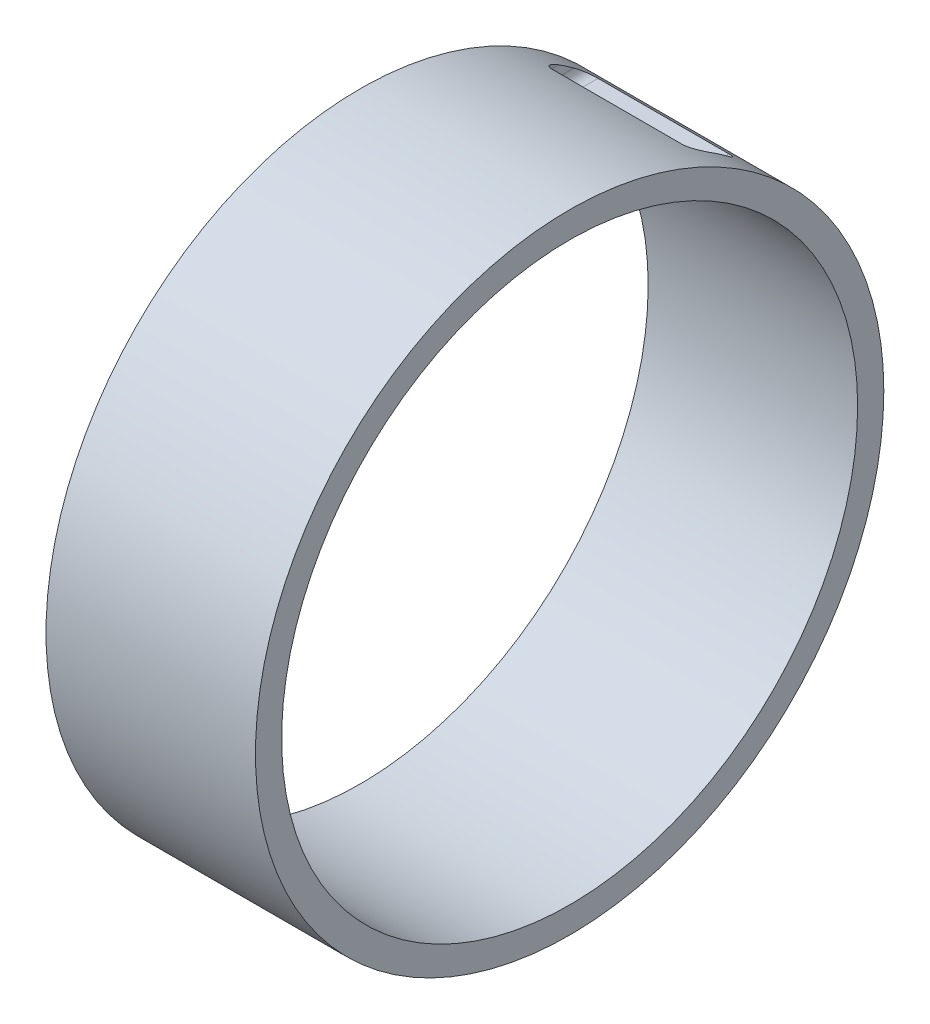
ISO-10303-21;
HEADER;
FILE_DESCRIPTION(('STEP AP214'),'2;1');
FILE_NAME('part.step','',(''),(''),'','','');
FILE_SCHEMA(('AUTOMOTIVE_DESIGN { 1 0 10303 214 1 1 1 1 }'));
ENDSEC;
DATA;
#1=APPLICATION_CONTEXT('core data for automotive mechanical design processes');
#2=APPLICATION_PROTOCOL_DEFINITION('international standard','automotive_design',2000,#1);
#3=PRODUCT_CONTEXT('',#1,'mechanical');
#4=PRODUCT('Part','Part','',(#3));
#5=PRODUCT_RELATED_PRODUCT_CATEGORY('part','',(#4));
#6=PRODUCT_DEFINITION_FORMATION('','',#4);
#7=PRODUCT_DEFINITION_CONTEXT('part definition',#1,'design');
#8=PRODUCT_DEFINITION('design','',#6,#7);
#9=PRODUCT_DEFINITION_SHAPE('','',#8);
#10=(LENGTH_UNIT() NAMED_UNIT(*) SI_UNIT(.MILLI.,.METRE.));
#11=(NAMED_UNIT(*) PLANE_ANGLE_UNIT() SI_UNIT($,.RADIAN.));
#12=(NAMED_UNIT(*) SI_UNIT($,.STERADIAN.) SOLID_ANGLE_UNIT());
#13=UNCERTAINTY_MEASURE_WITH_UNIT(LENGTH_MEASURE(1.E-05),#10,'distance_accuracy_value','');
#14=(GEOMETRIC_REPRESENTATION_CONTEXT(3) GLOBAL_UNCERTAINTY_ASSIGNED_CONTEXT((#13)) GLOBAL_UNIT_ASSIGNED_CONTEXT((#10,
#11,#12)) REPRESENTATION_CONTEXT('',''));
#15=CARTESIAN_POINT('',(0.,0.,0.));
#16=DIRECTION('',(0.,0.,1.));
#17=DIRECTION('',(1.,0.,0.));
#18=AXIS2_PLACEMENT_3D('',#15,#16,#17);
#19=CARTESIAN_POINT('',(25.4,0.,0.));
#20=DIRECTION('',(1.,0.,0.));
#21=DIRECTION('',(0.,0.,-1.));
#22=AXIS2_PLACEMENT_3D('',#19,#20,#21);
#23=PLANE('',#22);
#24=CARTESIAN_POINT('',(25.4,0.,0.));
#25=DIRECTION('',(1.,0.,0.));
#26=DIRECTION('',(0.,0.,-1.));
#27=AXIS2_PLACEMENT_3D('',#24,#25,#26);
#28=CIRCLE('',#27,76.2);
#29=CARTESIAN_POINT('',(25.4,0.,-76.2));
#30=VERTEX_POINT('',#29);
#31=EDGE_CURVE('E128',#30,#30,#28,.T.);
#32=ORIENTED_EDGE('',*,*,#31,.T.);
#33=EDGE_LOOP('',(#32));
#34=FACE_BOUND('',#33,.T.);
#35=CARTESIAN_POINT('',(25.4,0.,0.));
#36=DIRECTION('',(1.,0.,0.));
#37=DIRECTION('',(0.,0.,-1.));
#38=AXIS2_PLACEMENT_3D('',#35,#36,#37);
#39=CIRCLE('',#38,69.85);
#40=CARTESIAN_POINT('',(25.4,0.,-69.85));
#41=VERTEX_POINT('',#40);
#42=EDGE_CURVE('E220',#41,#41,#39,.T.);
#43=ORIENTED_EDGE('',*,*,#42,.F.);
#44=EDGE_LOOP('',(#43));
#45=FACE_BOUND('',#44,.T.);
#46=ADVANCED_FACE('F32',(#34,#45),#23,.T.);
#47=CARTESIAN_POINT('',(-25.4,0.,0.));
#48=DIRECTION('',(1.,0.,0.));
#49=DIRECTION('',(0.,0.,-1.));
#50=AXIS2_PLACEMENT_3D('',#47,#48,#49);
#51=PLANE('',#50);
#52=CARTESIAN_POINT('',(-25.4,0.,0.));
#53=DIRECTION('',(1.,0.,0.));
#54=DIRECTION('',(0.,0.,-1.));
#55=AXIS2_PLACEMENT_3D('',#52,#53,#54);
#56=CIRCLE('',#55,76.2);
#57=CARTESIAN_POINT('',(-25.4,0.,-76.2));
#58=VERTEX_POINT('',#57);
#59=EDGE_CURVE('E133',#58,#58,#56,.T.);
#60=ORIENTED_EDGE('',*,*,#59,.F.);
#61=EDGE_LOOP('',(#60));
#62=FACE_BOUND('',#61,.T.);
#63=CARTESIAN_POINT('',(-25.4,0.,0.));
#64=DIRECTION('',(1.,0.,0.));
#65=DIRECTION('',(0.,0.,-1.));
#66=AXIS2_PLACEMENT_3D('',#63,#64,#65);
#67=CIRCLE('',#66,69.85);
#68=CARTESIAN_POINT('',(-25.4,0.,-69.85));
#69=VERTEX_POINT('',#68);
#70=EDGE_CURVE('E221',#69,#69,#67,.T.);
#71=ORIENTED_EDGE('',*,*,#70,.T.);
#72=EDGE_LOOP('',(#71));
#73=FACE_BOUND('',#72,.T.);
#74=ADVANCED_FACE('F210',(#62,#73),#51,.F.);
#75=CARTESIAN_POINT('',(25.4,0.,0.));
#76=DIRECTION('',(-1.,0.,0.));
#77=DIRECTION('',(0.,0.,1.));
#78=AXIS2_PLACEMENT_3D('',#75,#76,#77);
#79=CYLINDRICAL_SURFACE('',#78,76.2);
#80=DIRECTION('',(-1.,0.,0.));
#81=VECTOR('',#80,1.);
#82=CARTESIAN_POINT('',(25.4,66.675,-36.8901663726257));
#83=LINE('',#82,#81);
#84=CARTESIAN_POINT('',(-15.875,66.675,-36.8901663726257));
#85=VERTEX_POINT('',#84);
#86=CARTESIAN_POINT('',(15.875,66.675,-36.8901663726257));
#87=VERTEX_POINT('',#86);
#88=EDGE_CURVE('E232',#85,#87,#83,.F.);
#89=ORIENTED_EDGE('',*,*,#88,.F.);
#90=CARTESIAN_POINT('',(-15.875,66.675,-36.8901663726257));
#91=CARTESIAN_POINT('',(-15.9125528643814,66.6750051266936,-36.8901567057449));
#92=CARTESIAN_POINT('',(-15.9500852718334,66.6741666158712,-36.8916726567766));
#93=CARTESIAN_POINT('',(-16.024800291679,66.6708532359372,-36.8976604526581));
#94=CARTESIAN_POINT('',(-16.0619832438782,66.6683801705647,-36.9021290392582));
#95=CARTESIAN_POINT('',(-16.1718129907983,66.6586583588189,-36.9196891904874));
#96=CARTESIAN_POINT('',(-16.2436241955906,66.6491043719812,-36.936940033587));
#97=CARTESIAN_POINT('',(-16.4002103086586,66.6216721216113,-36.9863997322653));
#98=CARTESIAN_POINT('',(-16.483878512848,66.6023324549095,-37.0212296641021));
#99=CARTESIAN_POINT('',(-16.6439449767763,66.55724858626,-37.1022212608402));
#100=CARTESIAN_POINT('',(-16.720307227958,66.5314747167076,-37.1484354040031));
#101=CARTESIAN_POINT('',(-16.9074586297388,66.458954348086,-37.2780841741451));
#102=CARTESIAN_POINT('',(-17.0126234805095,66.4086982144312,-37.3675893309396));
#103=CARTESIAN_POINT('',(-17.206655771776,66.3007905011026,-37.5587185006444));
#104=CARTESIAN_POINT('',(-17.2954893315623,66.2431239594759,-37.6603670014807));
#105=CARTESIAN_POINT('',(-17.4539542107774,66.1268504251507,-37.8641319733973));
#106=CARTESIAN_POINT('',(-17.5244775642815,66.0685704207115,-37.9657524768935));
#107=CARTESIAN_POINT('',(-17.6554110162912,65.9487305184317,-38.173542586677));
#108=CARTESIAN_POINT('',(-17.7158125052694,65.8871678865062,-38.2797159701593));
#109=CARTESIAN_POINT('',(-17.827937722729,65.7612724747456,-38.4955935422782));
#110=CARTESIAN_POINT('',(-17.8796264665118,65.6969297719986,-38.6053099518791));
#111=CARTESIAN_POINT('',(-17.9749789261709,65.5661647088155,-38.8269832295481));
#112=CARTESIAN_POINT('',(-18.0186402441688,65.4997417338916,-38.9389407560237));
#113=CARTESIAN_POINT('',(-18.1198592119057,65.3294020440842,-39.2243496693953));
#114=CARTESIAN_POINT('',(-18.1724736631223,65.2243164075517,-39.3988665500534));
#115=CARTESIAN_POINT('',(-18.2620006815305,65.0109062517826,-39.7500233913603));
#116=CARTESIAN_POINT('',(-18.2989027850477,64.9025796254251,-39.9266646865202));
#117=CARTESIAN_POINT('',(-18.3571617655918,64.6853486872083,-40.2776297786353));
#118=CARTESIAN_POINT('',(-18.3787896879128,64.5764908814272,-40.4519371432072));
#119=CARTESIAN_POINT('',(-18.4004735223983,64.4118369519973,-40.7132147608792));
#120=CARTESIAN_POINT('',(-18.4059084162904,64.3567589328186,-40.8002229603515));
#121=CARTESIAN_POINT('',(-18.4131694860146,64.2461813325217,-40.9741235983915));
#122=CARTESIAN_POINT('',(-18.4149956077825,64.1906817451005,-41.0610160352054));
#123=CARTESIAN_POINT('',(-18.415,64.135,-41.1478040118789));
#124=B_SPLINE_CURVE_WITH_KNOTS('',3,(#90,#91,#92,#93,#94,#95,#96,#97,#98,#99,#100,#101,#102,
#103,#104,#105,#106,#107,#108,#109,#110,#111,#112,#113,#114,#115,#116,#117,#118,#119,#120,#121,
#122,#123),.UNSPECIFIED.,.F.,.F.,(4,2,2,2,2,2,2,2,2,2,2,2,2,2,2,2,4),(0.,0.112580998817639,
0.225037970897442,0.447339872368279,0.723827977290132,1.00161528760194,1.44002369970265,
1.87933161070058,2.28894776232968,2.69891057888424,3.11048222919406,3.52217662133797,
4.15262471789859,4.78349200864135,5.40286216071111,5.71216479254917,6.02147205812361),.UNSPECIFIED.);
#125=CARTESIAN_POINT('',(-18.415,64.135,-41.1478040118789));
#126=VERTEX_POINT('',#125);
#127=EDGE_CURVE('E188',#85,#126,#124,.T.);
#128=ORIENTED_EDGE('',*,*,#127,.T.);
#129=CARTESIAN_POINT('',(-18.415,0.,0.));
#130=DIRECTION('',(-1.,0.,0.));
#131=DIRECTION('',(0.,0.,1.));
#132=AXIS2_PLACEMENT_3D('',#129,#130,#131);
#133=CIRCLE('',#132,76.2);
#134=CARTESIAN_POINT('',(-18.415,61.595,-44.8608512513973));
#135=VERTEX_POINT('',#134);
#136=EDGE_CURVE('E229',#135,#126,#133,.F.);
#137=ORIENTED_EDGE('',*,*,#136,.F.);
#138=CARTESIAN_POINT('',(-18.415,61.595,-44.8608512513973));
#139=CARTESIAN_POINT('',(-18.4149954250006,61.5386949247186,-44.9381597470649));
#140=CARTESIAN_POINT('',(-18.4131280407796,61.4822496064611,-45.0153542140712));
#141=CARTESIAN_POINT('',(-18.4055748552411,61.369148926074,-45.1694220987862));
#142=CARTESIAN_POINT('',(-18.3998883739413,61.312493528327,-45.2462954568691));
#143=CARTESIAN_POINT('',(-18.3769066681305,61.1419373863011,-45.4768081464263));
#144=CARTESIAN_POINT('',(-18.3536877724643,61.0278556746062,-45.6297785888821));
#145=CARTESIAN_POINT('',(-18.2899329455135,60.7987372144864,-45.9346319199144));
#146=CARTESIAN_POINT('',(-18.249171069149,60.6837079111032,-46.0864733666563));
#147=CARTESIAN_POINT('',(-18.1485926156648,60.4557573352468,-46.3850896151561));
#148=CARTESIAN_POINT('',(-18.0888114680992,60.3428325532014,-46.531873279642));
#149=CARTESIAN_POINT('',(-17.9865294744618,60.1820107642548,-46.7394081233));
#150=CARTESIAN_POINT('',(-17.9525689033565,60.1324602025622,-46.8031363108434));
#151=CARTESIAN_POINT('',(-17.8800077727999,60.0344672406605,-46.9287662029529));
#152=CARTESIAN_POINT('',(-17.8414072022475,59.9860248431028,-46.9906679031488));
#153=CARTESIAN_POINT('',(-17.7183937062005,59.8430589852029,-47.1727880971524));
#154=CARTESIAN_POINT('',(-17.6265736550603,59.7505801416987,-47.2898299587929));
#155=CARTESIAN_POINT('',(-17.4381115130021,59.5897730083474,-47.4922392813262));
#156=CARTESIAN_POINT('',(-17.3448864738581,59.5200005544768,-47.5796213264477));
#157=CARTESIAN_POINT('',(-17.1417989647074,59.3901684949479,-47.7415814398029));
#158=CARTESIAN_POINT('',(-17.0319600966361,59.3300953566409,-47.8161773565756));
#159=CARTESIAN_POINT('',(-16.8288682391994,59.2390691976159,-47.9288681477931));
#160=CARTESIAN_POINT('',(-16.7395991189078,59.204673949921,-47.9713330436526));
#161=CARTESIAN_POINT('',(-16.5535252545056,59.145370740913,-48.04443087896));
#162=CARTESIAN_POINT('',(-16.4567412649108,59.1204376960567,-48.0750951041207));
#163=CARTESIAN_POINT('',(-16.2793684029514,59.0861420139811,-48.1172359539401));
#164=CARTESIAN_POINT('',(-16.1998606045424,59.0745677776465,-48.1314408731894));
#165=CARTESIAN_POINT('',(-16.0790451985146,59.062882290818,-48.1457783216331));
#166=CARTESIAN_POINT('',(-16.0383936288196,59.0599328793916,-48.1493960829677));
#167=CARTESIAN_POINT('',(-15.9568328855824,59.0559894743263,-48.1542325430308));
#168=CARTESIAN_POINT('',(-15.9159235894076,59.054996495309,-48.1554499969407));
#169=CARTESIAN_POINT('',(-15.875,59.055,-48.1554459537029));
#170=B_SPLINE_CURVE_WITH_KNOTS('',3,(#138,#139,#140,#141,#142,#143,#144,#145,#146,#147,#148,
#149,#150,#151,#152,#153,#154,#155,#156,#157,#158,#159,#160,#161,#162,#163,#164,#165,#166,#167,
#168,#169),.UNSPECIFIED.,.F.,.F.,(4,2,2,2,2,2,2,2,2,2,2,2,2,2,2,4),(0.,0.286878193761009,
0.573807479136215,1.14974391110316,1.73333118240637,2.31583763674226,2.57843890786918,
2.84104080726816,3.36459765823201,3.79997090106545,4.23473135432006,4.54759887926013,
4.85963112562814,5.10349602452937,5.22614578998434,5.34885914586866),.UNSPECIFIED.);
#171=CARTESIAN_POINT('',(-15.875,59.055,-48.1554459537029));
#172=VERTEX_POINT('',#171);
#173=EDGE_CURVE('E112',#135,#172,#170,.T.);
#174=ORIENTED_EDGE('',*,*,#173,.T.);
#175=DIRECTION('',(-1.,0.,0.));
#176=VECTOR('',#175,1.);
#177=CARTESIAN_POINT('',(25.4,59.055,-48.1554459537029));
#178=LINE('',#177,#176);
#179=CARTESIAN_POINT('',(15.875,59.055,-48.1554459537029));
#180=VERTEX_POINT('',#179);
#181=EDGE_CURVE('E120',#180,#172,#178,.T.);
#182=ORIENTED_EDGE('',*,*,#181,.F.);
#183=CARTESIAN_POINT('',(15.875,59.055,-48.1554459537029));
#184=CARTESIAN_POINT('',(15.9283240424321,59.0549847477381,-48.1554637730757));
#185=CARTESIAN_POINT('',(15.9816347181549,59.0566786477897,-48.1533873426544));
#186=CARTESIAN_POINT('',(16.0876809929282,59.0633669615994,-48.1451839097741));
#187=CARTESIAN_POINT('',(16.1404171314554,59.068357947697,-48.1390611139263));
#188=CARTESIAN_POINT('',(16.2443356970763,59.0814546509494,-48.1229863557863));
#189=CARTESIAN_POINT('',(16.2955285773812,59.0895274452668,-48.1130748665393));
#190=CARTESIAN_POINT('',(16.3965242621352,59.1085854917785,-48.0896594923806));
#191=CARTESIAN_POINT('',(16.446326791244,59.1195713163997,-48.0761549014022));
#192=CARTESIAN_POINT('',(16.5927385837508,59.1564499766106,-48.0307811711515));
#193=CARTESIAN_POINT('',(16.6868669495011,59.1863324751737,-47.9939682892346));
#194=CARTESIAN_POINT('',(16.8669125376505,59.2546908080775,-47.909545742456));
#195=CARTESIAN_POINT('',(16.9528057674052,59.2931907234311,-47.861905816023));
#196=CARTESIAN_POINT('',(17.1558332986805,59.397337703253,-47.7326519743528));
#197=CARTESIAN_POINT('',(17.2675798023375,59.4670284147008,-47.6458467243563));
#198=CARTESIAN_POINT('',(17.4722395071392,59.6159798955069,-47.4593431025738));
#199=CARTESIAN_POINT('',(17.5651162635002,59.6952587210825,-47.3596203788733));
#200=CARTESIAN_POINT('',(17.7147635168004,59.8413780302971,-47.1747825507584));
#201=CARTESIAN_POINT('',(17.7749570911036,59.9070079695994,-47.0914235686855));
#202=CARTESIAN_POINT('',(17.8859522481032,60.0408957722613,-46.9205990025261));
#203=CARTESIAN_POINT('',(17.9367484806519,60.1091551060488,-46.8331311144471));
#204=CARTESIAN_POINT('',(18.0298268763155,60.2476678223506,-46.6548102189766));
#205=CARTESIAN_POINT('',(18.0720814025341,60.31792686423,-46.5639473158991));
#206=CARTESIAN_POINT('',(18.1485528399676,60.4596408632191,-46.3797944521438));
#207=CARTESIAN_POINT('',(18.182767929285,60.5310960874851,-46.2865039466328));
#208=CARTESIAN_POINT('',(18.2482654365433,60.6854644911023,-46.0839770164642));
#209=CARTESIAN_POINT('',(18.2783451379126,60.7684939189127,-45.9744413495075));
#210=CARTESIAN_POINT('',(18.3292942348228,60.9349867494797,-45.7535412578132));
#211=CARTESIAN_POINT('',(18.3501607212716,61.0184502809008,-45.6421762669586));
#212=CARTESIAN_POINT('',(18.3829942668417,61.1843479923943,-45.4195396050598));
#213=CARTESIAN_POINT('',(18.3950668943764,61.2667822956846,-45.3082834027356));
#214=CARTESIAN_POINT('',(18.4110550925861,61.431251737298,-45.0850373920885));
#215=CARTESIAN_POINT('',(18.4149776877874,61.5132871585158,-44.9730482990427));
#216=CARTESIAN_POINT('',(18.415,61.595,-44.8608512513973));
#217=B_SPLINE_CURVE_WITH_KNOTS('',3,(#183,#184,#185,#186,#187,#188,#189,#190,#191,#192,#193,
#194,#195,#196,#197,#198,#199,#200,#201,#202,#203,#204,#205,#206,#207,#208,#209,#210,#211,#212,
#213,#214,#215,#216),.UNSPECIFIED.,.F.,.F.,(4,2,2,2,2,2,2,2,2,2,2,2,2,2,2,2,4),(0.,
0.159883223173519,0.319600492290156,0.477657207520198,0.635745004840385,0.950364454739031,
1.26587432243975,1.73641791973754,2.20786185582576,2.57331859302011,2.93898275807396,
3.3058117412695,3.67272377525596,4.0944770709102,4.51636344098693,4.93309771020396,
5.34947264621507),.UNSPECIFIED.);
#218=CARTESIAN_POINT('',(18.415,61.595,-44.8608512513973));
#219=VERTEX_POINT('',#218);
#220=EDGE_CURVE('E11',#180,#219,#217,.T.);
#221=ORIENTED_EDGE('',*,*,#220,.T.);
#222=CARTESIAN_POINT('',(18.415,0.,0.));
#223=DIRECTION('',(1.,0.,0.));
#224=DIRECTION('',(0.,0.,-1.));
#225=AXIS2_PLACEMENT_3D('',#222,#223,#224);
#226=CIRCLE('',#225,76.2);
#227=CARTESIAN_POINT('',(18.415,64.135,-41.1478040118789));
#228=VERTEX_POINT('',#227);
#229=EDGE_CURVE('E225',#228,#219,#226,.F.);
#230=ORIENTED_EDGE('',*,*,#229,.F.);
#231=CARTESIAN_POINT('',(18.415,64.135,-41.1478040118789));
#232=CARTESIAN_POINT('',(18.414994791296,64.1930964531683,-41.0572523965933));
#233=CARTESIAN_POINT('',(18.4130073319023,64.2509940812318,-40.9665878397872));
#234=CARTESIAN_POINT('',(18.4051053570829,64.366329646873,-40.7851340810369));
#235=CARTESIAN_POINT('',(18.3991907421398,64.4237675727641,-40.6943448759921));
#236=CARTESIAN_POINT('',(18.3755880931376,64.5954717907566,-40.4216672271156));
#237=CARTESIAN_POINT('',(18.3520414851122,64.7089478006911,-40.2397504555502));
#238=CARTESIAN_POINT('',(18.2893035993684,64.9326000633337,-39.8778447918644));
#239=CARTESIAN_POINT('',(18.250188193226,65.042789573044,-39.6978508346417));
#240=CARTESIAN_POINT('',(18.1554941537809,65.259701968229,-39.3402456650143));
#241=CARTESIAN_POINT('',(18.0999306457791,65.3664279390781,-39.1626324195301));
#242=CARTESIAN_POINT('',(18.0094159473272,65.5127795872172,-38.9168654461332));
#243=CARTESIAN_POINT('',(17.9820929367444,65.5542537427461,-38.8469603641203));
#244=CARTESIAN_POINT('',(17.924360138557,65.6364136182305,-38.707980145052));
#245=CARTESIAN_POINT('',(17.893950618764,65.6770994062273,-38.6389049365704));
#246=CARTESIAN_POINT('',(17.7975396608975,65.7981735994089,-38.4326133907557));
#247=CARTESIAN_POINT('',(17.7265514849623,65.8772562144536,-38.2968732180157));
#248=CARTESIAN_POINT('',(17.5985992437237,66.0019549776911,-38.0813755757444));
#249=CARTESIAN_POINT('',(17.5463187629795,66.0490264426534,-37.9996662716716));
#250=CARTESIAN_POINT('',(17.43489309589,66.1408804359337,-37.8395618323535));
#251=CARTESIAN_POINT('',(17.3757435884195,66.1856614976287,-37.7611688260656));
#252=CARTESIAN_POINT('',(17.2500342520179,66.2719753028588,-37.6094783350357));
#253=CARTESIAN_POINT('',(17.1835183605778,66.3135250312667,-37.5361544688496));
#254=CARTESIAN_POINT('',(17.0418101161598,66.3925936501046,-37.3961220522209));
#255=CARTESIAN_POINT('',(16.9666330673319,66.4301194308937,-37.3294022090378));
#256=CARTESIAN_POINT('',(16.8209875759392,66.4933478538367,-37.2166372916694));
#257=CARTESIAN_POINT('',(16.7521376622924,66.5199604789654,-37.1690371224276));
#258=CARTESIAN_POINT('',(16.607493184095,66.5682849022914,-37.082420380964));
#259=CARTESIAN_POINT('',(16.5316956315045,66.5899945777928,-37.0434075267413));
#260=CARTESIAN_POINT('',(16.3723445600028,66.6271855500242,-36.9764743957922));
#261=CARTESIAN_POINT('',(16.2886962878064,66.6425741454509,-36.9487192877285));
#262=CARTESIAN_POINT('',(16.1599512564808,66.6593385607275,-36.9184602696288));
#263=CARTESIAN_POINT('',(16.1165476071526,66.6638718664291,-36.9102727276992));
#264=CARTESIAN_POINT('',(16.0290077275359,66.6707047193147,-36.8979293009515));
#265=CARTESIAN_POINT('',(15.9848720964481,66.6730060099132,-36.8937702694896));
#266=CARTESIAN_POINT('',(15.9187656988574,66.6747182922638,-36.8906754794021));
#267=CARTESIAN_POINT('',(15.896880380674,66.6750025759466,-36.8901615812883));
#268=CARTESIAN_POINT('',(15.875,66.675,-36.8901663726256));
#269=B_SPLINE_CURVE_WITH_KNOTS('',3,(#231,#232,#233,#234,#235,#236,#237,#238,#239,#240,#241,
#242,#243,#244,#245,#246,#247,#248,#249,#250,#251,#252,#253,#254,#255,#256,#257,#258,#259,#260,
#261,#262,#263,#264,#265,#266,#267,#268),.UNSPECIFIED.,.F.,.F.,(4,2,2,2,2,2,2,2,2,2,2,2,2,2,2,2,
2,2,4),(0.,0.322716460208758,0.645441098625899,1.29189205574998,1.93523049075487,
2.57797915445026,2.83518039440891,3.09235933646852,3.60869358306117,3.93193124518363,
4.25537336054707,4.57698078358536,4.89802840306839,5.16085367774551,5.42379252347253,
5.69046052110118,5.82345943895553,5.95635438823333,6.02200118957834),.UNSPECIFIED.);
#270=EDGE_CURVE('E187',#228,#87,#269,.T.);
#271=ORIENTED_EDGE('',*,*,#270,.T.);
#272=EDGE_LOOP('',(#89,#128,#137,#174,#182,#221,#230,#271));
#273=FACE_BOUND('',#272,.T.);
#274=ORIENTED_EDGE('',*,*,#31,.F.);
#275=EDGE_LOOP('',(#274));
#276=FACE_BOUND('',#275,.T.);
#277=ORIENTED_EDGE('',*,*,#59,.T.);
#278=EDGE_LOOP('',(#277));
#279=FACE_BOUND('',#278,.T.);
#280=ADVANCED_FACE('F170',(#273,#276,#279),#79,.T.);
#281=CARTESIAN_POINT('',(25.4,0.,0.));
#282=DIRECTION('',(-1.,0.,0.));
#283=DIRECTION('',(0.,0.,1.));
#284=AXIS2_PLACEMENT_3D('',#281,#282,#283);
#285=CYLINDRICAL_SURFACE('',#284,69.85);
#286=CARTESIAN_POINT('',(-18.415,0.,0.));
#287=DIRECTION('',(-1.,0.,0.));
#288=DIRECTION('',(0.,0.,1.));
#289=AXIS2_PLACEMENT_3D('',#286,#287,#288);
#290=CIRCLE('',#289,69.85);
#291=CARTESIAN_POINT('',(-18.415,64.135,-27.6717233832661));
#292=VERTEX_POINT('',#291);
#293=CARTESIAN_POINT('',(-18.415,61.595,-32.940529367331));
#294=VERTEX_POINT('',#293);
#295=EDGE_CURVE('E139',#292,#294,#290,.T.);
#296=ORIENTED_EDGE('',*,*,#295,.F.);
#297=CARTESIAN_POINT('',(-18.415,64.135,-27.6717233832661));
#298=CARTESIAN_POINT('',(-18.4149655871479,64.2200060511905,-27.4747089466487));
#299=CARTESIAN_POINT('',(-18.4107323758047,64.3040955872121,-27.2773134861748));
#300=CARTESIAN_POINT('',(-18.3941611692197,64.4703360278681,-26.882041774125));
#301=CARTESIAN_POINT('',(-18.381823059328,64.5524869050615,-26.6841655157873));
#302=CARTESIAN_POINT('',(-18.3492577462212,64.7151272751901,-26.2872789176954));
#303=CARTESIAN_POINT('',(-18.3289933574519,64.7956070259303,-26.0882676547492));
#304=CARTESIAN_POINT('',(-18.2806321770556,64.9544063753349,-25.6903381817574));
#305=CARTESIAN_POINT('',(-18.2525355465209,65.0327260183918,-25.4914199698821));
#306=CARTESIAN_POINT('',(-18.1883310469536,65.1871895220412,-25.0937912750126));
#307=CARTESIAN_POINT('',(-18.1522150825501,65.2633310956089,-24.8950812072486));
#308=CARTESIAN_POINT('',(-18.0715763496081,65.4132412024969,-24.4984755832883));
#309=CARTESIAN_POINT('',(-18.0270540735811,65.4870098745452,-24.3005799800676));
#310=CARTESIAN_POINT('',(-17.9289146113785,65.6318894636787,-23.9065173861973));
#311=CARTESIAN_POINT('',(-17.8753149158564,65.7030051769194,-23.7103478203642));
#312=CARTESIAN_POINT('',(-17.7576671994677,65.8424871326704,-23.3202108949776));
#313=CARTESIAN_POINT('',(-17.6936236179624,65.910854528078,-23.126242637026));
#314=CARTESIAN_POINT('',(-17.5976526451064,66.0018951368887,-22.8643348226802));
#315=CARTESIAN_POINT('',(-17.5712562217267,66.0259324328842,-22.7948263827843));
#316=CARTESIAN_POINT('',(-17.5166089871914,66.0735656885774,-22.6563847788794));
#317=CARTESIAN_POINT('',(-17.4883581519876,66.0971616425466,-22.5874516223438));
#318=CARTESIAN_POINT('',(-17.4297332636695,66.1439335199561,-22.4501188078989));
#319=CARTESIAN_POINT('',(-17.3993539739532,66.1671082172208,-22.3817209613764));
#320=CARTESIAN_POINT('',(-17.3362847869096,66.2129235578465,-22.245817478841));
#321=CARTESIAN_POINT('',(-17.3035949849055,66.2355642231883,-22.1783118061564));
#322=CARTESIAN_POINT('',(-17.2323290289384,66.2823815025991,-22.0380212146081));
#323=CARTESIAN_POINT('',(-17.1934889413216,66.3064977450748,-21.9653493426163));
#324=CARTESIAN_POINT('',(-17.1121058556332,66.3538707177611,-21.8218250273853));
#325=CARTESIAN_POINT('',(-17.0695635952074,66.3771276178833,-21.7509722253292));
#326=CARTESIAN_POINT('',(-16.9801841244933,66.4225037623043,-21.6120062859227));
#327=CARTESIAN_POINT('',(-16.9333626100423,66.4446267336899,-21.5438843582285));
#328=CARTESIAN_POINT('',(-16.8343371598464,66.4874851941528,-21.4112505901759));
#329=CARTESIAN_POINT('',(-16.782138912998,66.5082221122049,-21.3467350433556));
#330=CARTESIAN_POINT('',(-16.6826461892228,66.5436255492691,-21.236078586104));
#331=CARTESIAN_POINT('',(-16.6366217767202,66.5586526773559,-21.1889230689157));
#332=CARTESIAN_POINT('',(-16.539389066969,66.5870927104255,-21.0993789201579));
#333=CARTESIAN_POINT('',(-16.4881690939076,66.6005018244385,-21.0570014982163));
#334=CARTESIAN_POINT('',(-16.3788978110344,66.6251578414968,-20.9788594645393));
#335=CARTESIAN_POINT('',(-16.3207438440661,66.6363634264211,-20.9432216257939));
#336=CARTESIAN_POINT('',(-16.1983842716333,66.6550749001558,-20.8835935598267));
#337=CARTESIAN_POINT('',(-16.1342274133746,66.6626079516372,-20.8595178377126));
#338=CARTESIAN_POINT('',(-16.0365966445387,66.670050990462,-20.8357113316305));
#339=CARTESIAN_POINT('',(-16.0047326866866,66.6718865071072,-20.8298362452215));
#340=CARTESIAN_POINT('',(-15.9402636349557,66.6743696551884,-20.8218860192315));
#341=CARTESIAN_POINT('',(-15.9076548901879,66.6750087807403,-20.8198380894444));
#342=CARTESIAN_POINT('',(-15.875,66.675,-20.8198673146589));
#343=B_SPLINE_CURVE_WITH_KNOTS('',3,(#297,#298,#299,#300,#301,#302,#303,#304,#305,#306,#307,
#308,#309,#310,#311,#312,#313,#314,#315,#316,#317,#318,#319,#320,#321,#322,#323,#324,#325,#326,
#327,#328,#329,#330,#331,#332,#333,#334,#335,#336,#337,#338,#339,#340,#341,#342),.UNSPECIFIED.,
.F.,.F.,(4,2,2,2,2,2,2,2,2,2,2,2,2,2,2,2,2,2,2,2,2,2,4),(0.,0.643651006086674,1.28731111730163,
1.93402784711191,2.58073127633627,3.22809053306778,3.87541187387717,4.52149983854988,
5.16731388436583,5.4017172196681,5.63612359532442,5.87112842943751,6.10612357376033,
6.36360839006271,6.62104202031251,6.87756665498658,7.13382260654819,7.33629623690707,
7.53923540785781,7.7456775936118,7.95056881692398,8.04769549367407,8.14551011927511),.UNSPECIFIED.);
#344=CARTESIAN_POINT('',(-15.875,66.675,-20.8198673146589));
#345=VERTEX_POINT('',#344);
#346=EDGE_CURVE('E176',#292,#345,#343,.T.);
#347=ORIENTED_EDGE('',*,*,#346,.T.);
#348=DIRECTION('',(-1.,0.,0.));
#349=VECTOR('',#348,1.);
#350=CARTESIAN_POINT('',(25.4,66.675,-20.8198673146589));
#351=LINE('',#350,#349);
#352=CARTESIAN_POINT('',(15.875,66.675,-20.8198673146589));
#353=VERTEX_POINT('',#352);
#354=EDGE_CURVE('E130',#353,#345,#351,.T.);
#355=ORIENTED_EDGE('',*,*,#354,.F.);
#356=CARTESIAN_POINT('',(15.875,66.675,-20.8198673146589));
#357=CARTESIAN_POINT('',(15.9003396125104,66.6750033144349,-20.8198563055346));
#358=CARTESIAN_POINT('',(15.9256615483526,66.6746205222922,-20.8210826059251));
#359=CARTESIAN_POINT('',(15.9760150119385,66.6731146258585,-20.825904450396));
#360=CARTESIAN_POINT('',(16.0010469560946,66.6719927663555,-20.82949601074));
#361=CARTESIAN_POINT('',(16.0746881405233,66.6676098842046,-20.8435215205754));
#362=CARTESIAN_POINT('',(16.122637174185,66.6633293984337,-20.8572133977717));
#363=CARTESIAN_POINT('',(16.2275586129546,66.6511049928709,-20.8962487351197));
#364=CARTESIAN_POINT('',(16.2836450471298,66.6424987849916,-20.9236933755151));
#365=CARTESIAN_POINT('',(16.3908242071986,66.6226745702285,-20.9867297981499));
#366=CARTESIAN_POINT('',(16.4418829809888,66.6114403339929,-21.0223721814652));
#367=CARTESIAN_POINT('',(16.5341062085355,66.5884052604463,-21.0952149942723));
#368=CARTESIAN_POINT('',(16.5757483260099,66.5767808660038,-21.1318802165264));
#369=CARTESIAN_POINT('',(16.6556268083153,66.552429740704,-21.2084466982128));
#370=CARTESIAN_POINT('',(16.6938601636623,66.5397020549587,-21.2483507588884));
#371=CARTESIAN_POINT('',(16.7674145925732,66.513386770313,-21.3305824600472));
#372=CARTESIAN_POINT('',(16.80273110168,66.4997978803465,-21.3729137297542));
#373=CARTESIAN_POINT('',(16.8707852237047,66.471955510954,-21.4593498112414));
#374=CARTESIAN_POINT('',(16.9035237481536,66.4577022692948,-21.5034539877448));
#375=CARTESIAN_POINT('',(16.9833736421505,66.4210293995348,-21.6165329422631));
#376=CARTESIAN_POINT('',(17.0290203883911,66.3982464863508,-21.6864227042626));
#377=CARTESIAN_POINT('',(17.11610465125,66.3516838752997,-21.8284711713065));
#378=CARTESIAN_POINT('',(17.1575400122587,66.3279036756777,-21.9006310137997));
#379=CARTESIAN_POINT('',(17.2767028441228,66.2552693403793,-22.1197973470519));
#380=CARTESIAN_POINT('',(17.3491415692876,66.2051917443935,-22.2692735347487));
#381=CARTESIAN_POINT('',(17.484076641036,66.1021545666701,-22.5732968142502));
#382=CARTESIAN_POINT('',(17.5464787618297,66.0491733017728,-22.7278771972533));
#383=CARTESIAN_POINT('',(17.6626303631928,65.9411713163792,-23.0393482769491));
#384=CARTESIAN_POINT('',(17.7163879578241,65.8861525687381,-23.1962366544723));
#385=CARTESIAN_POINT('',(17.8241110891971,65.7659534466322,-23.5350547927376));
#386=CARTESIAN_POINT('',(17.8769223296648,65.7004772400465,-23.717243867812));
#387=CARTESIAN_POINT('',(17.9742797113209,65.5672788924917,-24.083030189328));
#388=CARTESIAN_POINT('',(18.0188241302589,65.4995562869803,-24.2666277209195));
#389=CARTESIAN_POINT('',(18.100459558086,65.3619220663292,-24.6349416124252));
#390=CARTESIAN_POINT('',(18.1375404973617,65.2920076389731,-24.8196591420721));
#391=CARTESIAN_POINT('',(18.2046291702263,65.1501750756165,-25.1896096853565));
#392=CARTESIAN_POINT('',(18.234636725123,65.078256889047,-25.3748427118974));
#393=CARTESIAN_POINT('',(18.2865113179571,64.9360368464523,-25.7365407331102));
#394=CARTESIAN_POINT('',(18.3087026699893,64.8658258543645,-25.9129951146013));
#395=CARTESIAN_POINT('',(18.3469235985031,64.7237312360947,-26.2658961451669));
#396=CARTESIAN_POINT('',(18.3629532271501,64.6518476240785,-26.4423427942942));
#397=CARTESIAN_POINT('',(18.3887380674612,64.5066816077371,-26.7945272024096));
#398=CARTESIAN_POINT('',(18.3985111421064,64.4334038063639,-26.9702655431557));
#399=CARTESIAN_POINT('',(18.4116314086108,64.2853248045174,-27.3213443500954));
#400=CARTESIAN_POINT('',(18.414978418555,64.2105235609777,-27.4966848048849));
#401=CARTESIAN_POINT('',(18.415,64.135,-27.6717233832661));
#402=B_SPLINE_CURVE_WITH_KNOTS('',3,(#356,#357,#358,#359,#360,#361,#362,#363,#364,#365,#366,
#367,#368,#369,#370,#371,#372,#373,#374,#375,#376,#377,#378,#379,#380,#381,#382,#383,#384,#385,
#386,#387,#388,#389,#390,#391,#392,#393,#394,#395,#396,#397,#398,#399,#400,#401),.UNSPECIFIED.,
.F.,.F.,(4,2,2,2,2,2,2,2,2,2,2,2,2,2,2,2,2,2,2,2,2,2,4),(0.,0.0759546148166747,
0.151781627614934,0.301092882854172,0.489137565247463,0.678375689064753,0.848194720546339,
1.01816222496552,1.18839085492709,1.3585590221597,1.61795315462278,1.87747939705793,
2.39734030670184,2.92182801311892,3.44582050615279,4.04761590010947,4.64953652740898,
5.25226389209122,5.85500648161529,6.42850633969172,7.00200134240504,7.57385157967336,
8.14571800517554),.UNSPECIFIED.);
#403=CARTESIAN_POINT('',(18.415,64.135,-27.6717233832661));
#404=VERTEX_POINT('',#403);
#405=EDGE_CURVE('E182',#353,#404,#402,.T.);
#406=ORIENTED_EDGE('',*,*,#405,.T.);
#407=CARTESIAN_POINT('',(18.415,0.,0.));
#408=DIRECTION('',(1.,0.,0.));
#409=DIRECTION('',(0.,0.,-1.));
#410=AXIS2_PLACEMENT_3D('',#407,#408,#409);
#411=CIRCLE('',#410,69.85);
#412=CARTESIAN_POINT('',(18.415,61.595,-32.940529367331));
#413=VERTEX_POINT('',#412);
#414=EDGE_CURVE('E127',#413,#404,#411,.T.);
#415=ORIENTED_EDGE('',*,*,#414,.F.);
#416=CARTESIAN_POINT('',(18.415,61.595,-32.940529367331));
#417=CARTESIAN_POINT('',(18.4149965756116,61.5447208326439,-33.0345458771741));
#418=CARTESIAN_POINT('',(18.4135074460487,61.4942286724588,-33.1284424109865));
#419=CARTESIAN_POINT('',(18.4074529480481,61.39285107015,-33.3159375796031));
#420=CARTESIAN_POINT('',(18.4028872075502,61.3419655811961,-33.4095361770018));
#421=CARTESIAN_POINT('',(18.3843902417523,61.1885537218586,-33.6901899182754));
#422=CARTESIAN_POINT('',(18.3656583001589,61.0855015761229,-33.8766736715788));
#423=CARTESIAN_POINT('',(18.3140728225795,60.8780599501757,-34.2480623710268));
#424=CARTESIAN_POINT('',(18.2811555978145,60.7736665236058,-34.4329563143731));
#425=CARTESIAN_POINT('',(18.199412056158,60.5648125744928,-34.7989979436126));
#426=CARTESIAN_POINT('',(18.1506039062315,60.4603522638765,-34.9801496574177));
#427=CARTESIAN_POINT('',(18.0690643919384,60.3143791549227,-35.2307418543399));
#428=CARTESIAN_POINT('',(18.0440646458886,60.2724204491598,-35.3024737661106));
#429=CARTESIAN_POINT('',(17.9908008760727,60.1887835784358,-35.4448818326839));
#430=CARTESIAN_POINT('',(17.9625368806702,60.1471054110404,-35.5155579966541));
#431=CARTESIAN_POINT('',(17.8724714825177,60.0226704227117,-35.7257331460062));
#432=CARTESIAN_POINT('',(17.8053955399615,59.9405110415728,-35.8633823469918));
#433=CARTESIAN_POINT('',(17.6540446210266,59.7786886625215,-36.1324732435391));
#434=CARTESIAN_POINT('',(17.5696449217761,59.6990488946273,-36.2638608937051));
#435=CARTESIAN_POINT('',(17.4279487909905,59.5841247667475,-36.4521607627257));
#436=CARTESIAN_POINT('',(17.3782382763593,59.5465958275471,-36.5134263905863));
#437=CARTESIAN_POINT('',(17.2732736026396,59.4735565958684,-36.6322728481603));
#438=CARTESIAN_POINT('',(17.2180225440177,59.4380451916238,-36.6898557095119));
#439=CARTESIAN_POINT('',(17.0923545552796,59.364360843881,-36.8089770741373));
#440=CARTESIAN_POINT('',(17.0209162139796,59.3266363973996,-36.8697321671675));
#441=CARTESIAN_POINT('',(16.8692493551187,59.2561853631774,-36.9828533210986));
#442=CARTESIAN_POINT('',(16.7890167297289,59.2234611282781,-37.0352154332602));
#443=CARTESIAN_POINT('',(16.6185946857404,59.1645886700025,-37.1291942630116));
#444=CARTESIAN_POINT('',(16.5282883613324,59.138532435922,-37.1706608588306));
#445=CARTESIAN_POINT('',(16.3400507088259,59.0960948789629,-37.2380946970258));
#446=CARTESIAN_POINT('',(16.2421509575031,59.0796756910802,-37.2641226040265));
#447=CARTESIAN_POINT('',(16.0982600735666,59.0644412648129,-37.2882601526032));
#448=CARTESIAN_POINT('',(16.0539208607108,59.0609171374504,-37.2938412545461));
#449=CARTESIAN_POINT('',(15.9647332905033,59.0561916787439,-37.3013235039372));
#450=CARTESIAN_POINT('',(15.919884177351,59.0549944269551,-37.3032181882421));
#451=CARTESIAN_POINT('',(15.875,59.055,-37.3032099825203));
#452=B_SPLINE_CURVE_WITH_KNOTS('',3,(#416,#417,#418,#419,#420,#421,#422,#423,#424,#425,#426,
#427,#428,#429,#430,#431,#432,#433,#434,#435,#436,#437,#438,#439,#440,#441,#442,#443,#444,#445,
#446,#447,#448,#449,#450,#451),.UNSPECIFIED.,.F.,.F.,(4,2,2,2,2,2,2,2,2,2,2,2,2,2,2,2,2,4),(0.,
0.319826804388957,0.639692292955927,1.28088164044276,1.9249802795679,2.56834513701916,
2.82863233903599,3.08891727954294,3.6094743908529,4.13391970983611,4.39579830424209,
4.65753116164991,4.96007853383574,5.26276783367819,5.56943163568177,5.87488231344983,
6.00917812381471,6.14370917439673),.UNSPECIFIED.);
#453=CARTESIAN_POINT('',(15.875,59.055,-37.3032099825203));
#454=VERTEX_POINT('',#453);
#455=EDGE_CURVE('E45',#413,#454,#452,.T.);
#456=ORIENTED_EDGE('',*,*,#455,.T.);
#457=DIRECTION('',(-1.,0.,0.));
#458=VECTOR('',#457,1.);
#459=CARTESIAN_POINT('',(25.4,59.055,-37.3032099825203));
#460=LINE('',#459,#458);
#461=CARTESIAN_POINT('',(-15.875,59.055,-37.3032099825203));
#462=VERTEX_POINT('',#461);
#463=EDGE_CURVE('E118',#462,#454,#460,.F.);
#464=ORIENTED_EDGE('',*,*,#463,.F.);
#465=CARTESIAN_POINT('',(-15.875,59.055,-37.3032099825203));
#466=CARTESIAN_POINT('',(-15.9156332119058,59.0549950417475,-37.3032173848645));
#467=CARTESIAN_POINT('',(-15.9562437879739,59.055975871629,-37.3016651092769));
#468=CARTESIAN_POINT('',(-16.0371096457003,59.0598563035641,-37.2955210948858));
#469=CARTESIAN_POINT('',(-16.0773651903074,59.0627543387854,-37.2909318380485));
#470=CARTESIAN_POINT('',(-16.196491399841,59.0741763678042,-37.2728372515356));
#471=CARTESIAN_POINT('',(-16.2744870923759,59.0854304466085,-37.2550018119008));
#472=CARTESIAN_POINT('',(-16.4258498819217,59.1142529755776,-37.2092502759819));
#473=CARTESIAN_POINT('',(-16.4992300329219,59.131802580367,-37.1813642644745));
#474=CARTESIAN_POINT('',(-16.6408497312918,59.1720866666944,-37.1172211127363));
#475=CARTESIAN_POINT('',(-16.7090769013773,59.194833134934,-37.0809446172057));
#476=CARTESIAN_POINT('',(-16.8847735465355,59.2613600188598,-36.9745836870231));
#477=CARTESIAN_POINT('',(-16.9871047054262,59.3088744680651,-36.8983642355838));
#478=CARTESIAN_POINT('',(-17.1767640020103,59.4112666810955,-36.7332735690298));
#479=CARTESIAN_POINT('',(-17.2640494271107,59.4661646449657,-36.6443676035712));
#480=CARTESIAN_POINT('',(-17.4135890635028,59.5722637889583,-36.4715868643231));
#481=CARTESIAN_POINT('',(-17.4776375738936,59.6228446756277,-36.3888553762178));
#482=CARTESIAN_POINT('',(-17.5971909990075,59.7263331504095,-36.2187458254684));
#483=CARTESIAN_POINT('',(-17.6526895823248,59.7792424258236,-36.1313643832429));
#484=CARTESIAN_POINT('',(-17.7561764631109,59.8866833310877,-35.953004329982));
#485=CARTESIAN_POINT('',(-17.804151781956,59.9412175755375,-35.8620198345447));
#486=CARTESIAN_POINT('',(-17.8933227637969,60.0513076853539,-35.6773670899374));
#487=CARTESIAN_POINT('',(-17.9345159304306,60.1068639185645,-35.583697867406));
#488=CARTESIAN_POINT('',(-18.0438664540415,60.2669943039274,-35.3122345846256));
#489=CARTESIAN_POINT('',(-18.1044774995722,60.3723487359733,-35.1318436688407));
#490=CARTESIAN_POINT('',(-18.2079154361107,60.5836032170341,-34.7662799638023));
#491=CARTESIAN_POINT('',(-18.2507258759628,60.6895036795997,-34.5811029183523));
#492=CARTESIAN_POINT('',(-18.3208235344012,60.9007896954619,-34.2076356728384));
#493=CARTESIAN_POINT('',(-18.3481134393099,61.0061753347327,-34.0193460173199));
#494=CARTESIAN_POINT('',(-18.3887922714948,61.2157485111421,-33.6407702360785));
#495=CARTESIAN_POINT('',(-18.4021892254632,61.319936705657,-33.4504853273867));
#496=CARTESIAN_POINT('',(-18.4111391775841,61.452078155039,-33.2064488888967));
#497=CARTESIAN_POINT('',(-18.4125923289884,61.4807829437957,-33.1532726028248));
#498=CARTESIAN_POINT('',(-18.4145219660113,61.538014149197,-33.0469204619488));
#499=CARTESIAN_POINT('',(-18.4150000721507,61.5665407831187,-32.9937447535527));
#500=CARTESIAN_POINT('',(-18.415,61.595,-32.940529367331));
#501=B_SPLINE_CURVE_WITH_KNOTS('',3,(#465,#466,#467,#468,#469,#470,#471,#472,#473,#474,#475,
#476,#477,#478,#479,#480,#481,#482,#483,#484,#485,#486,#487,#488,#489,#490,#491,#492,#493,#494,
#495,#496,#497,#498,#499,#500),.UNSPECIFIED.,.F.,.F.,(4,2,2,2,2,2,2,2,2,2,2,2,2,2,2,2,2,4),(0.,
0.121815747677844,0.243532064449151,0.484700431984394,0.725152815894187,0.966165511052878,
1.37229590431709,1.77956090360794,2.12770265069783,2.47610097771937,2.82509387821398,
3.17421494957172,3.82570820125818,4.47780222586042,5.12978335047004,5.78138758090059,
5.96272281480566,6.14375642392194),.UNSPECIFIED.);
#502=EDGE_CURVE('E102',#462,#294,#501,.T.);
#503=ORIENTED_EDGE('',*,*,#502,.T.);
#504=EDGE_LOOP('',(#296,#347,#355,#406,#415,#456,#464,#503));
#505=FACE_BOUND('',#504,.T.);
#506=ORIENTED_EDGE('',*,*,#42,.T.);
#507=EDGE_LOOP('',(#506));
#508=FACE_BOUND('',#507,.T.);
#509=ORIENTED_EDGE('',*,*,#70,.F.);
#510=EDGE_LOOP('',(#509));
#511=FACE_BOUND('',#510,.T.);
#512=ADVANCED_FACE('F124',(#505,#508,#511),#285,.F.);
#513=CARTESIAN_POINT('',(-18.415,66.675,-76.201));
#514=DIRECTION('',(-1.,0.,0.));
#515=DIRECTION('',(0.,0.,1.));
#516=AXIS2_PLACEMENT_3D('',#513,#514,#515);
#517=PLANE('',#516);
#518=ORIENTED_EDGE('',*,*,#295,.T.);
#519=DIRECTION('',(0.,0.,1.));
#520=VECTOR('',#519,1.);
#521=CARTESIAN_POINT('',(-18.415,61.595,-48.1554459537029));
#522=LINE('',#521,#520);
#523=EDGE_CURVE('E107',#294,#135,#522,.F.);
#524=ORIENTED_EDGE('',*,*,#523,.T.);
#525=ORIENTED_EDGE('',*,*,#136,.T.);
#526=DIRECTION('',(0.,0.,1.));
#527=VECTOR('',#526,1.);
#528=CARTESIAN_POINT('',(-18.415,64.135,-20.8198673146589));
#529=LINE('',#528,#527);
#530=EDGE_CURVE('E121',#126,#292,#529,.T.);
#531=ORIENTED_EDGE('',*,*,#530,.T.);
#532=EDGE_LOOP('',(#518,#524,#525,#531));
#533=FACE_BOUND('',#532,.T.);
#534=ADVANCED_FACE('F169',(#533),#517,.F.);
#535=CARTESIAN_POINT('',(-18.415,66.675,-76.201));
#536=DIRECTION('',(0.,1.,0.));
#537=DIRECTION('',(0.,0.,1.));
#538=AXIS2_PLACEMENT_3D('',#535,#536,#537);
#539=PLANE('',#538);
#540=ORIENTED_EDGE('',*,*,#354,.T.);
#541=DIRECTION('',(0.,0.,1.));
#542=VECTOR('',#541,1.);
#543=CARTESIAN_POINT('',(-15.875,66.675,-36.8901663726257));
#544=LINE('',#543,#542);
#545=EDGE_CURVE('E148',#345,#85,#544,.F.);
#546=ORIENTED_EDGE('',*,*,#545,.T.);
#547=ORIENTED_EDGE('',*,*,#88,.T.);
#548=DIRECTION('',(0.,0.,1.));
#549=VECTOR('',#548,1.);
#550=CARTESIAN_POINT('',(15.875,66.675,-20.8198673146589));
#551=LINE('',#550,#549);
#552=EDGE_CURVE('E145',#87,#353,#551,.T.);
#553=ORIENTED_EDGE('',*,*,#552,.T.);
#554=EDGE_LOOP('',(#540,#546,#547,#553));
#555=FACE_BOUND('',#554,.T.);
#556=ADVANCED_FACE('F246',(#555),#539,.F.);
#557=CARTESIAN_POINT('',(18.415,66.675,-76.201));
#558=DIRECTION('',(1.,0.,0.));
#559=DIRECTION('',(0.,0.,-1.));
#560=AXIS2_PLACEMENT_3D('',#557,#558,#559);
#561=PLANE('',#560);
#562=ORIENTED_EDGE('',*,*,#414,.T.);
#563=DIRECTION('',(0.,0.,1.));
#564=VECTOR('',#563,1.);
#565=CARTESIAN_POINT('',(18.415,64.135,-36.8901663726256));
#566=LINE('',#565,#564);
#567=EDGE_CURVE('E57',#404,#228,#566,.F.);
#568=ORIENTED_EDGE('',*,*,#567,.T.);
#569=ORIENTED_EDGE('',*,*,#229,.T.);
#570=DIRECTION('',(0.,0.,1.));
#571=VECTOR('',#570,1.);
#572=CARTESIAN_POINT('',(18.415,61.595,-37.3032099825203));
#573=LINE('',#572,#571);
#574=EDGE_CURVE('E150',#219,#413,#573,.T.);
#575=ORIENTED_EDGE('',*,*,#574,.T.);
#576=EDGE_LOOP('',(#562,#568,#569,#575));
#577=FACE_BOUND('',#576,.T.);
#578=ADVANCED_FACE('F236',(#577),#561,.F.);
#579=CARTESIAN_POINT('',(-18.415,59.055,-76.201));
#580=DIRECTION('',(0.,-1.,0.));
#581=DIRECTION('',(0.,0.,-1.));
#582=AXIS2_PLACEMENT_3D('',#579,#580,#581);
#583=PLANE('',#582);
#584=ORIENTED_EDGE('',*,*,#181,.T.);
#585=DIRECTION('',(0.,0.,1.));
#586=VECTOR('',#585,1.);
#587=CARTESIAN_POINT('',(-15.875,59.055,-37.3032099825203));
#588=LINE('',#587,#586);
#589=EDGE_CURVE('E106',#172,#462,#588,.T.);
#590=ORIENTED_EDGE('',*,*,#589,.T.);
#591=ORIENTED_EDGE('',*,*,#463,.T.);
#592=DIRECTION('',(0.,0.,1.));
#593=VECTOR('',#592,1.);
#594=CARTESIAN_POINT('',(15.875,59.055,-48.1554459537029));
#595=LINE('',#594,#593);
#596=EDGE_CURVE('E122',#454,#180,#595,.F.);
#597=ORIENTED_EDGE('',*,*,#596,.T.);
#598=EDGE_LOOP('',(#584,#590,#591,#597));
#599=FACE_BOUND('',#598,.T.);
#600=ADVANCED_FACE('F117',(#599),#583,.F.);
#601=CARTESIAN_POINT('',(-15.875,61.595,-76.201));
#602=DIRECTION('',(0.,0.,-1.));
#603=DIRECTION('',(-1.,0.,0.));
#604=AXIS2_PLACEMENT_3D('',#601,#602,#603);
#605=CYLINDRICAL_SURFACE('',#604,2.54);
#606=ORIENTED_EDGE('',*,*,#173,.F.);
#607=ORIENTED_EDGE('',*,*,#523,.F.);
#608=ORIENTED_EDGE('',*,*,#502,.F.);
#609=ORIENTED_EDGE('',*,*,#589,.F.);
#610=EDGE_LOOP('',(#606,#607,#608,#609));
#611=FACE_BOUND('',#610,.T.);
#612=ADVANCED_FACE('F105',(#611),#605,.F.);
#613=CARTESIAN_POINT('',(-15.875,64.135,-76.201));
#614=DIRECTION('',(0.,0.,-1.));
#615=DIRECTION('',(-1.,0.,0.));
#616=AXIS2_PLACEMENT_3D('',#613,#614,#615);
#617=CYLINDRICAL_SURFACE('',#616,2.54);
#618=ORIENTED_EDGE('',*,*,#127,.F.);
#619=ORIENTED_EDGE('',*,*,#545,.F.);
#620=ORIENTED_EDGE('',*,*,#346,.F.);
#621=ORIENTED_EDGE('',*,*,#530,.F.);
#622=EDGE_LOOP('',(#618,#619,#620,#621));
#623=FACE_BOUND('',#622,.T.);
#624=ADVANCED_FACE('F198',(#623),#617,.F.);
#625=CARTESIAN_POINT('',(15.875,64.135,-76.201));
#626=DIRECTION('',(0.,0.,-1.));
#627=DIRECTION('',(-1.,0.,0.));
#628=AXIS2_PLACEMENT_3D('',#625,#626,#627);
#629=CYLINDRICAL_SURFACE('',#628,2.54);
#630=ORIENTED_EDGE('',*,*,#270,.F.);
#631=ORIENTED_EDGE('',*,*,#567,.F.);
#632=ORIENTED_EDGE('',*,*,#405,.F.);
#633=ORIENTED_EDGE('',*,*,#552,.F.);
#634=EDGE_LOOP('',(#630,#631,#632,#633));
#635=FACE_BOUND('',#634,.T.);
#636=ADVANCED_FACE('F195',(#635),#629,.F.);
#637=CARTESIAN_POINT('',(15.875,61.595,-76.201));
#638=DIRECTION('',(0.,0.,-1.));
#639=DIRECTION('',(-1.,0.,0.));
#640=AXIS2_PLACEMENT_3D('',#637,#638,#639);
#641=CYLINDRICAL_SURFACE('',#640,2.54);
#642=ORIENTED_EDGE('',*,*,#220,.F.);
#643=ORIENTED_EDGE('',*,*,#596,.F.);
#644=ORIENTED_EDGE('',*,*,#455,.F.);
#645=ORIENTED_EDGE('',*,*,#574,.F.);
#646=EDGE_LOOP('',(#642,#643,#644,#645));
#647=FACE_BOUND('',#646,.T.);
#648=ADVANCED_FACE('F34',(#647),#641,.F.);
#649=CLOSED_SHELL('',(#46,#74,#280,#512,#534,#556,#578,#600,#612,#624,#636,#648));
#650=MANIFOLD_SOLID_BREP('B2',#649);
#651=ADVANCED_BREP_SHAPE_REPRESENTATION('',(#18,#650),#14);
#652=SHAPE_DEFINITION_REPRESENTATION(#9,#651);
ENDSEC;
END-ISO-10303-21;
